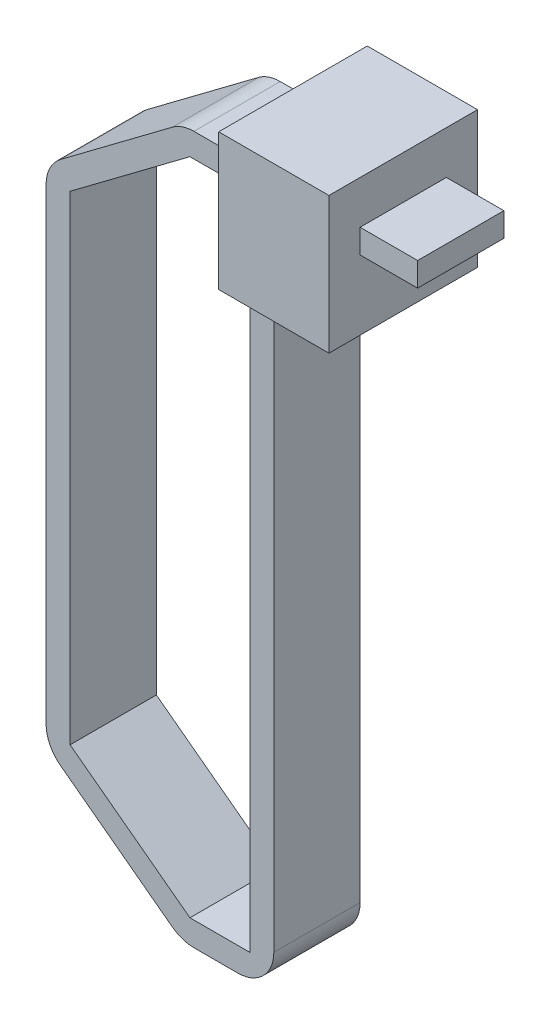
ISO-10303-21;
HEADER;
FILE_DESCRIPTION(('STEP AP214'),'2;1');
FILE_NAME('part.step','',(''),(''),'','','');
FILE_SCHEMA(('AUTOMOTIVE_DESIGN { 1 0 10303 214 1 1 1 1 }'));
ENDSEC;
DATA;
#1=APPLICATION_CONTEXT('core data for automotive mechanical design processes');
#2=APPLICATION_PROTOCOL_DEFINITION('international standard','automotive_design',2000,#1);
#3=PRODUCT_CONTEXT('',#1,'mechanical');
#4=PRODUCT('Part','Part','',(#3));
#5=PRODUCT_RELATED_PRODUCT_CATEGORY('part','',(#4));
#6=PRODUCT_DEFINITION_FORMATION('','',#4);
#7=PRODUCT_DEFINITION_CONTEXT('part definition',#1,'design');
#8=PRODUCT_DEFINITION('design','',#6,#7);
#9=PRODUCT_DEFINITION_SHAPE('','',#8);
#10=(LENGTH_UNIT() NAMED_UNIT(*) SI_UNIT(.MILLI.,.METRE.));
#11=(NAMED_UNIT(*) PLANE_ANGLE_UNIT() SI_UNIT($,.RADIAN.));
#12=(NAMED_UNIT(*) SI_UNIT($,.STERADIAN.) SOLID_ANGLE_UNIT());
#13=UNCERTAINTY_MEASURE_WITH_UNIT(LENGTH_MEASURE(1.E-05),#10,'distance_accuracy_value','');
#14=(GEOMETRIC_REPRESENTATION_CONTEXT(3) GLOBAL_UNCERTAINTY_ASSIGNED_CONTEXT((#13)) GLOBAL_UNIT_ASSIGNED_CONTEXT((#10,
#11,#12)) REPRESENTATION_CONTEXT('',''));
#15=CARTESIAN_POINT('',(0.,0.,0.));
#16=DIRECTION('',(0.,0.,1.));
#17=DIRECTION('',(1.,0.,0.));
#18=AXIS2_PLACEMENT_3D('',#15,#16,#17);
#19=CARTESIAN_POINT('',(12.065,18.7325,2.286));
#20=DIRECTION('',(-1.,0.,0.));
#21=DIRECTION('',(0.,0.,1.));
#22=AXIS2_PLACEMENT_3D('',#19,#20,#21);
#23=PLANE('',#22);
#24=DIRECTION('',(0.,0.,-1.));
#25=VECTOR('',#24,1.);
#26=CARTESIAN_POINT('',(12.065,18.7325,2.286));
#27=LINE('',#26,#25);
#28=CARTESIAN_POINT('',(12.065,18.7325,-2.286));
#29=VERTEX_POINT('',#28);
#30=CARTESIAN_POINT('',(12.065,18.7325,2.286));
#31=VERTEX_POINT('',#30);
#32=EDGE_CURVE('E308',#29,#31,#27,.F.);
#33=ORIENTED_EDGE('',*,*,#32,.T.);
#34=DIRECTION('',(0.,1.,0.));
#35=VECTOR('',#34,1.);
#36=CARTESIAN_POINT('',(12.065,0.,2.286));
#37=LINE('',#36,#35);
#38=CARTESIAN_POINT('',(12.065,17.4625,2.286));
#39=VERTEX_POINT('',#38);
#40=EDGE_CURVE('E311',#39,#31,#37,.T.);
#41=ORIENTED_EDGE('',*,*,#40,.F.);
#42=DIRECTION('',(0.,0.,1.));
#43=VECTOR('',#42,1.);
#44=CARTESIAN_POINT('',(12.065,17.4625,2.286));
#45=LINE('',#44,#43);
#46=CARTESIAN_POINT('',(12.065,17.4625,-2.286));
#47=VERTEX_POINT('',#46);
#48=EDGE_CURVE('E299',#39,#47,#45,.F.);
#49=ORIENTED_EDGE('',*,*,#48,.T.);
#50=DIRECTION('',(0.,1.,0.));
#51=VECTOR('',#50,1.);
#52=CARTESIAN_POINT('',(12.065,0.,-2.286));
#53=LINE('',#52,#51);
#54=EDGE_CURVE('E348',#47,#29,#53,.T.);
#55=ORIENTED_EDGE('',*,*,#54,.T.);
#56=EDGE_LOOP('',(#33,#41,#49,#55));
#57=FACE_BOUND('',#56,.T.);
#58=ADVANCED_FACE('F17',(#57),#23,.F.);
#59=CARTESIAN_POINT('',(0.,0.,-2.286));
#60=DIRECTION('',(0.,0.,1.));
#61=DIRECTION('',(1.,0.,0.));
#62=AXIS2_PLACEMENT_3D('',#59,#60,#61);
#63=PLANE('',#62);
#64=DIRECTION('',(0.,1.,0.));
#65=VECTOR('',#64,1.);
#66=CARTESIAN_POINT('',(9.017,0.,-2.286));
#67=LINE('',#66,#65);
#68=CARTESIAN_POINT('',(9.017,18.7325,-2.286));
#69=VERTEX_POINT('',#68);
#70=CARTESIAN_POINT('',(9.017,17.4625,-2.286));
#71=VERTEX_POINT('',#70);
#72=EDGE_CURVE('E345',#69,#71,#67,.F.);
#73=ORIENTED_EDGE('',*,*,#72,.F.);
#74=DIRECTION('',(1.,0.,0.));
#75=VECTOR('',#74,1.);
#76=CARTESIAN_POINT('',(4.445,18.7325,-2.286));
#77=LINE('',#76,#75);
#78=EDGE_CURVE('E302',#69,#29,#77,.T.);
#79=ORIENTED_EDGE('',*,*,#78,.T.);
#80=ORIENTED_EDGE('',*,*,#54,.F.);
#81=DIRECTION('',(1.,0.,0.));
#82=VECTOR('',#81,1.);
#83=CARTESIAN_POINT('',(4.445,17.4625,-2.286));
#84=LINE('',#83,#82);
#85=EDGE_CURVE('E296',#47,#71,#84,.F.);
#86=ORIENTED_EDGE('',*,*,#85,.T.);
#87=EDGE_LOOP('',(#73,#79,#80,#86));
#88=FACE_BOUND('',#87,.T.);
#89=ADVANCED_FACE('F756',(#88),#63,.F.);
#90=CARTESIAN_POINT('',(0.,0.,2.286));
#91=DIRECTION('',(0.,0.,1.));
#92=DIRECTION('',(1.,0.,0.));
#93=AXIS2_PLACEMENT_3D('',#90,#91,#92);
#94=PLANE('',#93);
#95=ORIENTED_EDGE('',*,*,#40,.T.);
#96=DIRECTION('',(1.,0.,0.));
#97=VECTOR('',#96,1.);
#98=CARTESIAN_POINT('',(4.445,18.7325,2.286));
#99=LINE('',#98,#97);
#100=CARTESIAN_POINT('',(9.017,18.7325,2.286));
#101=VERTEX_POINT('',#100);
#102=EDGE_CURVE('E305',#31,#101,#99,.F.);
#103=ORIENTED_EDGE('',*,*,#102,.T.);
#104=DIRECTION('',(0.,1.,0.));
#105=VECTOR('',#104,1.);
#106=CARTESIAN_POINT('',(9.017,0.,2.286));
#107=LINE('',#106,#105);
#108=CARTESIAN_POINT('',(9.017,17.4625,2.286));
#109=VERTEX_POINT('',#108);
#110=EDGE_CURVE('E342',#101,#109,#107,.F.);
#111=ORIENTED_EDGE('',*,*,#110,.T.);
#112=DIRECTION('',(1.,0.,0.));
#113=VECTOR('',#112,1.);
#114=CARTESIAN_POINT('',(4.445,17.4625,2.286));
#115=LINE('',#114,#113);
#116=EDGE_CURVE('E122',#109,#39,#115,.T.);
#117=ORIENTED_EDGE('',*,*,#116,.T.);
#118=EDGE_LOOP('',(#95,#103,#111,#117));
#119=FACE_BOUND('',#118,.T.);
#120=ADVANCED_FACE('F747',(#119),#94,.T.);
#121=CARTESIAN_POINT('',(4.445,18.7325,2.286));
#122=DIRECTION('',(0.,-1.,0.));
#123=DIRECTION('',(0.,0.,-1.));
#124=AXIS2_PLACEMENT_3D('',#121,#122,#123);
#125=PLANE('',#124);
#126=DIRECTION('',(0.,0.,1.));
#127=VECTOR('',#126,1.);
#128=CARTESIAN_POINT('',(9.017,18.7325,3.937));
#129=LINE('',#128,#127);
#130=EDGE_CURVE('E265',#69,#101,#129,.T.);
#131=ORIENTED_EDGE('',*,*,#130,.T.);
#132=ORIENTED_EDGE('',*,*,#102,.F.);
#133=ORIENTED_EDGE('',*,*,#32,.F.);
#134=ORIENTED_EDGE('',*,*,#78,.F.);
#135=EDGE_LOOP('',(#131,#132,#133,#134));
#136=FACE_BOUND('',#135,.T.);
#137=ADVANCED_FACE('F738',(#136),#125,.F.);
#138=CARTESIAN_POINT('',(4.445,17.4625,2.286));
#139=DIRECTION('',(0.,1.,0.));
#140=DIRECTION('',(0.,0.,1.));
#141=AXIS2_PLACEMENT_3D('',#138,#139,#140);
#142=PLANE('',#141);
#143=DIRECTION('',(0.,0.,1.));
#144=VECTOR('',#143,1.);
#145=CARTESIAN_POINT('',(9.017,17.4625,3.937));
#146=LINE('',#145,#144);
#147=EDGE_CURVE('E262',#109,#71,#146,.F.);
#148=ORIENTED_EDGE('',*,*,#147,.T.);
#149=ORIENTED_EDGE('',*,*,#85,.F.);
#150=ORIENTED_EDGE('',*,*,#48,.F.);
#151=ORIENTED_EDGE('',*,*,#116,.F.);
#152=EDGE_LOOP('',(#148,#149,#150,#151));
#153=FACE_BOUND('',#152,.T.);
#154=ADVANCED_FACE('F730',(#153),#142,.F.);
#155=CARTESIAN_POINT('',(0.211666666666673,-16.8275,2.286));
#156=DIRECTION('',(0.,0.,-1.));
#157=DIRECTION('',(-1.,0.,0.));
#158=AXIS2_PLACEMENT_3D('',#155,#156,#157);
#159=CYLINDRICAL_SURFACE('',#158,1.905);
#160=CARTESIAN_POINT('',(0.211666666666673,-16.8275,2.286));
#161=DIRECTION('',(0.,0.,-1.));
#162=DIRECTION('',(-1.,0.,0.));
#163=AXIS2_PLACEMENT_3D('',#160,#161,#162);
#164=CIRCLE('',#163,1.905);
#165=CARTESIAN_POINT('',(0.211666666666674,-18.7325,2.286));
#166=VERTEX_POINT('',#165);
#167=CARTESIAN_POINT('',(-0.931333333333327,-18.3515,2.286));
#168=VERTEX_POINT('',#167);
#169=EDGE_CURVE('E121',#166,#168,#164,.T.);
#170=ORIENTED_EDGE('',*,*,#169,.T.);
#171=DIRECTION('',(0.,0.,1.));
#172=VECTOR('',#171,1.);
#173=CARTESIAN_POINT('',(-0.931333333333327,-18.3515,2.286));
#174=LINE('',#173,#172);
#175=CARTESIAN_POINT('',(-0.931333333333327,-18.3515,-2.286));
#176=VERTEX_POINT('',#175);
#177=EDGE_CURVE('E119',#168,#176,#174,.F.);
#178=ORIENTED_EDGE('',*,*,#177,.T.);
#179=CARTESIAN_POINT('',(0.211666666666673,-16.8275,-2.286));
#180=DIRECTION('',(0.,0.,-1.));
#181=DIRECTION('',(-1.,0.,0.));
#182=AXIS2_PLACEMENT_3D('',#179,#180,#181);
#183=CIRCLE('',#182,1.905);
#184=CARTESIAN_POINT('',(0.211666666666674,-18.7325,-2.286));
#185=VERTEX_POINT('',#184);
#186=EDGE_CURVE('E20',#176,#185,#183,.F.);
#187=ORIENTED_EDGE('',*,*,#186,.T.);
#188=DIRECTION('',(0.,0.,1.));
#189=VECTOR('',#188,1.);
#190=CARTESIAN_POINT('',(0.211666666666674,-18.7325,2.286));
#191=LINE('',#190,#189);
#192=EDGE_CURVE('E116',#185,#166,#191,.T.);
#193=ORIENTED_EDGE('',*,*,#192,.T.);
#194=EDGE_LOOP('',(#170,#178,#187,#193));
#195=FACE_BOUND('',#194,.T.);
#196=ADVANCED_FACE('F115',(#195),#159,.T.);
#197=CARTESIAN_POINT('',(0.211666666666673,16.8275,2.286));
#198=DIRECTION('',(0.,0.,-1.));
#199=DIRECTION('',(-1.,0.,0.));
#200=AXIS2_PLACEMENT_3D('',#197,#198,#199);
#201=CYLINDRICAL_SURFACE('',#200,1.905);
#202=CARTESIAN_POINT('',(0.211666666666673,16.8275,2.286));
#203=DIRECTION('',(0.,0.,-1.));
#204=DIRECTION('',(-1.,0.,0.));
#205=AXIS2_PLACEMENT_3D('',#202,#203,#204);
#206=CIRCLE('',#205,1.905);
#207=CARTESIAN_POINT('',(-0.931333333333326,18.3515,2.286));
#208=VERTEX_POINT('',#207);
#209=CARTESIAN_POINT('',(0.211666666666673,18.7325,2.286));
#210=VERTEX_POINT('',#209);
#211=EDGE_CURVE('E329',#208,#210,#206,.T.);
#212=ORIENTED_EDGE('',*,*,#211,.T.);
#213=DIRECTION('',(0.,0.,1.));
#214=VECTOR('',#213,1.);
#215=CARTESIAN_POINT('',(0.211666666666673,18.7325,2.286));
#216=LINE('',#215,#214);
#217=CARTESIAN_POINT('',(0.211666666666673,18.7325,-2.286));
#218=VERTEX_POINT('',#217);
#219=EDGE_CURVE('E211',#210,#218,#216,.F.);
#220=ORIENTED_EDGE('',*,*,#219,.T.);
#221=CARTESIAN_POINT('',(0.211666666666673,16.8275,-2.286));
#222=DIRECTION('',(0.,0.,-1.));
#223=DIRECTION('',(-1.,0.,0.));
#224=AXIS2_PLACEMENT_3D('',#221,#222,#223);
#225=CIRCLE('',#224,1.905);
#226=CARTESIAN_POINT('',(-0.931333333333326,18.3515,-2.286));
#227=VERTEX_POINT('',#226);
#228=EDGE_CURVE('E365',#218,#227,#225,.F.);
#229=ORIENTED_EDGE('',*,*,#228,.T.);
#230=DIRECTION('',(0.,0.,1.));
#231=VECTOR('',#230,1.);
#232=CARTESIAN_POINT('',(-0.931333333333325,18.3515,2.286));
#233=LINE('',#232,#231);
#234=EDGE_CURVE('E227',#227,#208,#233,.T.);
#235=ORIENTED_EDGE('',*,*,#234,.T.);
#236=EDGE_LOOP('',(#212,#220,#229,#235));
#237=FACE_BOUND('',#236,.T.);
#238=ADVANCED_FACE('F517',(#237),#201,.T.);
#239=CARTESIAN_POINT('',(3.175,13.7795,3.937));
#240=DIRECTION('',(0.,1.,0.));
#241=DIRECTION('',(0.,0.,1.));
#242=AXIS2_PLACEMENT_3D('',#239,#240,#241);
#243=PLANE('',#242);
#244=DIRECTION('',(-1.,0.,0.));
#245=VECTOR('',#244,1.);
#246=CARTESIAN_POINT('',(2.54,13.7795,2.286));
#247=LINE('',#246,#245);
#248=CARTESIAN_POINT('',(3.175,13.7795,2.286));
#249=VERTEX_POINT('',#248);
#250=CARTESIAN_POINT('',(4.445,13.7795,2.286));
#251=VERTEX_POINT('',#250);
#252=EDGE_CURVE('E199',#249,#251,#247,.F.);
#253=ORIENTED_EDGE('',*,*,#252,.T.);
#254=DIRECTION('',(0.,0.,1.));
#255=VECTOR('',#254,1.);
#256=CARTESIAN_POINT('',(4.445,13.7795,2.286));
#257=LINE('',#256,#255);
#258=CARTESIAN_POINT('',(4.445,13.7795,-2.286));
#259=VERTEX_POINT('',#258);
#260=EDGE_CURVE('E242',#251,#259,#257,.F.);
#261=ORIENTED_EDGE('',*,*,#260,.T.);
#262=DIRECTION('',(1.,0.,0.));
#263=VECTOR('',#262,1.);
#264=CARTESIAN_POINT('',(3.175,13.7795,-2.286));
#265=LINE('',#264,#263);
#266=CARTESIAN_POINT('',(3.175,13.7795,-2.286));
#267=VERTEX_POINT('',#266);
#268=EDGE_CURVE('E280',#267,#259,#265,.T.);
#269=ORIENTED_EDGE('',*,*,#268,.F.);
#270=DIRECTION('',(0.,0.,1.));
#271=VECTOR('',#270,1.);
#272=CARTESIAN_POINT('',(3.175,13.7795,3.937));
#273=LINE('',#272,#271);
#274=CARTESIAN_POINT('',(3.175,13.7795,-3.937));
#275=VERTEX_POINT('',#274);
#276=EDGE_CURVE('E291',#275,#267,#273,.T.);
#277=ORIENTED_EDGE('',*,*,#276,.F.);
#278=DIRECTION('',(1.,0.,0.));
#279=VECTOR('',#278,1.);
#280=CARTESIAN_POINT('',(0.,13.7795,-3.937));
#281=LINE('',#280,#279);
#282=CARTESIAN_POINT('',(9.017,13.7795,-3.937));
#283=VERTEX_POINT('',#282);
#284=EDGE_CURVE('E169',#275,#283,#281,.T.);
#285=ORIENTED_EDGE('',*,*,#284,.T.);
#286=DIRECTION('',(0.,0.,1.));
#287=VECTOR('',#286,1.);
#288=CARTESIAN_POINT('',(9.017,13.7795,3.937));
#289=LINE('',#288,#287);
#290=CARTESIAN_POINT('',(9.017,13.7795,3.937));
#291=VERTEX_POINT('',#290);
#292=EDGE_CURVE('E245',#283,#291,#289,.T.);
#293=ORIENTED_EDGE('',*,*,#292,.T.);
#294=DIRECTION('',(1.,0.,0.));
#295=VECTOR('',#294,1.);
#296=CARTESIAN_POINT('',(0.,13.7795,3.937));
#297=LINE('',#296,#295);
#298=CARTESIAN_POINT('',(3.175,13.7795,3.937));
#299=VERTEX_POINT('',#298);
#300=EDGE_CURVE('E179',#299,#291,#297,.T.);
#301=ORIENTED_EDGE('',*,*,#300,.F.);
#302=DIRECTION('',(0.,0.,1.));
#303=VECTOR('',#302,1.);
#304=CARTESIAN_POINT('',(3.175,13.7795,3.937));
#305=LINE('',#304,#303);
#306=EDGE_CURVE('E268',#249,#299,#305,.T.);
#307=ORIENTED_EDGE('',*,*,#306,.F.);
#308=EDGE_LOOP('',(#253,#261,#269,#277,#285,#293,#301,#307));
#309=FACE_BOUND('',#308,.T.);
#310=ADVANCED_FACE('F479',(#309),#243,.F.);
#311=CARTESIAN_POINT('',(9.017,21.0185,3.937));
#312=DIRECTION('',(-1.,0.,0.));
#313=DIRECTION('',(0.,0.,1.));
#314=AXIS2_PLACEMENT_3D('',#311,#312,#313);
#315=PLANE('',#314);
#316=DIRECTION('',(0.,0.,-1.));
#317=VECTOR('',#316,1.);
#318=CARTESIAN_POINT('',(9.017,21.0185,3.937));
#319=LINE('',#318,#317);
#320=CARTESIAN_POINT('',(9.017,21.0185,-3.937));
#321=VERTEX_POINT('',#320);
#322=CARTESIAN_POINT('',(9.017,21.0185,3.937));
#323=VERTEX_POINT('',#322);
#324=EDGE_CURVE('E173',#321,#323,#319,.F.);
#325=ORIENTED_EDGE('',*,*,#324,.T.);
#326=DIRECTION('',(0.,1.,0.));
#327=VECTOR('',#326,1.);
#328=CARTESIAN_POINT('',(9.017,0.,3.937));
#329=LINE('',#328,#327);
#330=EDGE_CURVE('E176',#291,#323,#329,.T.);
#331=ORIENTED_EDGE('',*,*,#330,.F.);
#332=ORIENTED_EDGE('',*,*,#292,.F.);
#333=DIRECTION('',(0.,1.,0.));
#334=VECTOR('',#333,1.);
#335=CARTESIAN_POINT('',(9.017,0.,-3.937));
#336=LINE('',#335,#334);
#337=EDGE_CURVE('E166',#283,#321,#336,.T.);
#338=ORIENTED_EDGE('',*,*,#337,.T.);
#339=EDGE_LOOP('',(#325,#331,#332,#338));
#340=FACE_BOUND('',#339,.T.);
#341=ORIENTED_EDGE('',*,*,#110,.F.);
#342=ORIENTED_EDGE('',*,*,#130,.F.);
#343=ORIENTED_EDGE('',*,*,#72,.T.);
#344=ORIENTED_EDGE('',*,*,#147,.F.);
#345=EDGE_LOOP('',(#341,#342,#343,#344));
#346=FACE_BOUND('',#345,.T.);
#347=ADVANCED_FACE('F700',(#340,#346),#315,.F.);
#348=CARTESIAN_POINT('',(-6.35,-12.7,2.286));
#349=DIRECTION('',(1.,0.,0.));
#350=DIRECTION('',(0.,0.,-1.));
#351=AXIS2_PLACEMENT_3D('',#348,#349,#350);
#352=PLANE('',#351);
#353=DIRECTION('',(0.,1.,0.));
#354=VECTOR('',#353,1.);
#355=CARTESIAN_POINT('',(-6.35,-16.8275,2.286));
#356=LINE('',#355,#354);
#357=CARTESIAN_POINT('',(-6.35,12.7,2.286));
#358=VERTEX_POINT('',#357);
#359=CARTESIAN_POINT('',(-6.35,-12.7,2.286));
#360=VERTEX_POINT('',#359);
#361=EDGE_CURVE('E205',#358,#360,#356,.F.);
#362=ORIENTED_EDGE('',*,*,#361,.T.);
#363=DIRECTION('',(0.,0.,1.));
#364=VECTOR('',#363,1.);
#365=CARTESIAN_POINT('',(-6.35,-12.7,2.286));
#366=LINE('',#365,#364);
#367=CARTESIAN_POINT('',(-6.35,-12.7,-2.286));
#368=VERTEX_POINT('',#367);
#369=EDGE_CURVE('E220',#368,#360,#366,.T.);
#370=ORIENTED_EDGE('',*,*,#369,.F.);
#371=DIRECTION('',(0.,1.,0.));
#372=VECTOR('',#371,1.);
#373=CARTESIAN_POINT('',(-6.35,-16.8275,-2.286));
#374=LINE('',#373,#372);
#375=CARTESIAN_POINT('',(-6.35,12.7,-2.286));
#376=VERTEX_POINT('',#375);
#377=EDGE_CURVE('E152',#376,#368,#374,.F.);
#378=ORIENTED_EDGE('',*,*,#377,.F.);
#379=DIRECTION('',(0.,0.,1.));
#380=VECTOR('',#379,1.);
#381=CARTESIAN_POINT('',(-6.35,12.7,2.286));
#382=LINE('',#381,#380);
#383=EDGE_CURVE('E217',#358,#376,#382,.F.);
#384=ORIENTED_EDGE('',*,*,#383,.F.);
#385=EDGE_LOOP('',(#362,#370,#378,#384));
#386=FACE_BOUND('',#385,.T.);
#387=ADVANCED_FACE('F497',(#386),#352,.T.);
#388=CARTESIAN_POINT('',(4.445,16.8275,2.286));
#389=DIRECTION('',(-1.,0.,0.));
#390=DIRECTION('',(0.,0.,1.));
#391=AXIS2_PLACEMENT_3D('',#388,#389,#390);
#392=PLANE('',#391);
#393=DIRECTION('',(0.,1.,0.));
#394=VECTOR('',#393,1.);
#395=CARTESIAN_POINT('',(4.445,-16.8275,2.286));
#396=LINE('',#395,#394);
#397=CARTESIAN_POINT('',(4.445,-16.8275,2.286));
#398=VERTEX_POINT('',#397);
#399=EDGE_CURVE('E197',#251,#398,#396,.F.);
#400=ORIENTED_EDGE('',*,*,#399,.T.);
#401=DIRECTION('',(0.,0.,-1.));
#402=VECTOR('',#401,1.);
#403=CARTESIAN_POINT('',(4.445,-16.8275,2.286));
#404=LINE('',#403,#402);
#405=CARTESIAN_POINT('',(4.445,-16.8275,-2.286));
#406=VERTEX_POINT('',#405);
#407=EDGE_CURVE('E132',#406,#398,#404,.F.);
#408=ORIENTED_EDGE('',*,*,#407,.F.);
#409=DIRECTION('',(0.,1.,0.));
#410=VECTOR('',#409,1.);
#411=CARTESIAN_POINT('',(4.445,-16.8275,-2.286));
#412=LINE('',#411,#410);
#413=EDGE_CURVE('E142',#259,#406,#412,.F.);
#414=ORIENTED_EDGE('',*,*,#413,.F.);
#415=ORIENTED_EDGE('',*,*,#260,.F.);
#416=EDGE_LOOP('',(#400,#408,#414,#415));
#417=FACE_BOUND('',#416,.T.);
#418=ADVANCED_FACE('F485',(#417),#392,.F.);
#419=CARTESIAN_POINT('',(2.54,-16.8275,2.286));
#420=DIRECTION('',(0.,0.,-1.));
#421=DIRECTION('',(-1.,0.,0.));
#422=AXIS2_PLACEMENT_3D('',#419,#420,#421);
#423=CYLINDRICAL_SURFACE('',#422,1.905);
#424=CARTESIAN_POINT('',(2.54,-16.8275,2.286));
#425=DIRECTION('',(0.,0.,-1.));
#426=DIRECTION('',(-1.,0.,0.));
#427=AXIS2_PLACEMENT_3D('',#424,#425,#426);
#428=CIRCLE('',#427,1.905);
#429=CARTESIAN_POINT('',(2.54,-18.7325,2.286));
#430=VERTEX_POINT('',#429);
#431=EDGE_CURVE('E196',#398,#430,#428,.T.);
#432=ORIENTED_EDGE('',*,*,#431,.T.);
#433=DIRECTION('',(0.,0.,1.));
#434=VECTOR('',#433,1.);
#435=CARTESIAN_POINT('',(2.54,-18.7325,2.286));
#436=LINE('',#435,#434);
#437=CARTESIAN_POINT('',(2.54,-18.7325,-2.286));
#438=VERTEX_POINT('',#437);
#439=EDGE_CURVE('E131',#430,#438,#436,.F.);
#440=ORIENTED_EDGE('',*,*,#439,.T.);
#441=CARTESIAN_POINT('',(2.54,-16.8275,-2.286));
#442=DIRECTION('',(0.,0.,-1.));
#443=DIRECTION('',(-1.,0.,0.));
#444=AXIS2_PLACEMENT_3D('',#441,#442,#443);
#445=CIRCLE('',#444,1.905);
#446=EDGE_CURVE('E137',#406,#438,#445,.T.);
#447=ORIENTED_EDGE('',*,*,#446,.F.);
#448=ORIENTED_EDGE('',*,*,#407,.T.);
#449=EDGE_LOOP('',(#432,#440,#447,#448));
#450=FACE_BOUND('',#449,.T.);
#451=ADVANCED_FACE('F488',(#450),#423,.T.);
#452=CARTESIAN_POINT('',(2.54,-18.7325,2.286));
#453=DIRECTION('',(0.,1.,0.));
#454=DIRECTION('',(-1.,0.,0.));
#455=AXIS2_PLACEMENT_3D('',#452,#453,#454);
#456=PLANE('',#455);
#457=ORIENTED_EDGE('',*,*,#439,.F.);
#458=DIRECTION('',(-1.,0.,0.));
#459=VECTOR('',#458,1.);
#460=CARTESIAN_POINT('',(2.54,-18.7325,2.286));
#461=LINE('',#460,#459);
#462=EDGE_CURVE('E130',#430,#166,#461,.T.);
#463=ORIENTED_EDGE('',*,*,#462,.T.);
#464=ORIENTED_EDGE('',*,*,#192,.F.);
#465=DIRECTION('',(-1.,0.,0.));
#466=VECTOR('',#465,1.);
#467=CARTESIAN_POINT('',(2.54,-18.7325,-2.286));
#468=LINE('',#467,#466);
#469=EDGE_CURVE('E127',#438,#185,#468,.T.);
#470=ORIENTED_EDGE('',*,*,#469,.F.);
#471=EDGE_LOOP('',(#457,#463,#464,#470));
#472=FACE_BOUND('',#471,.T.);
#473=ADVANCED_FACE('F126',(#472),#456,.F.);
#474=CARTESIAN_POINT('',(-0.931333333333327,-18.3515,2.286));
#475=DIRECTION('',(0.6,0.8,0.));
#476=DIRECTION('',(-0.8,0.6,0.));
#477=AXIS2_PLACEMENT_3D('',#474,#475,#476);
#478=PLANE('',#477);
#479=ORIENTED_EDGE('',*,*,#177,.F.);
#480=DIRECTION('',(-0.8,0.6,0.));
#481=VECTOR('',#480,1.);
#482=CARTESIAN_POINT('',(-0.931333333333327,-18.3515,2.286));
#483=LINE('',#482,#481);
#484=CARTESIAN_POINT('',(-6.858,-13.9065,2.286));
#485=VERTEX_POINT('',#484);
#486=EDGE_CURVE('E193',#168,#485,#483,.T.);
#487=ORIENTED_EDGE('',*,*,#486,.T.);
#488=DIRECTION('',(0.,0.,-1.));
#489=VECTOR('',#488,1.);
#490=CARTESIAN_POINT('',(-6.858,-13.9065,2.286));
#491=LINE('',#490,#489);
#492=CARTESIAN_POINT('',(-6.858,-13.9065,-2.286));
#493=VERTEX_POINT('',#492);
#494=EDGE_CURVE('E235',#493,#485,#491,.F.);
#495=ORIENTED_EDGE('',*,*,#494,.F.);
#496=DIRECTION('',(-0.8,0.6,0.));
#497=VECTOR('',#496,1.);
#498=CARTESIAN_POINT('',(-0.931333333333327,-18.3515,-2.286));
#499=LINE('',#498,#497);
#500=EDGE_CURVE('E138',#176,#493,#499,.T.);
#501=ORIENTED_EDGE('',*,*,#500,.F.);
#502=EDGE_LOOP('',(#479,#487,#495,#501));
#503=FACE_BOUND('',#502,.T.);
#504=ADVANCED_FACE('F368',(#503),#478,.F.);
#505=CARTESIAN_POINT('',(-5.715,-12.3825,2.286));
#506=DIRECTION('',(0.,0.,-1.));
#507=DIRECTION('',(-1.,0.,0.));
#508=AXIS2_PLACEMENT_3D('',#505,#506,#507);
#509=CYLINDRICAL_SURFACE('',#508,1.905);
#510=CARTESIAN_POINT('',(-5.715,-12.3825,2.286));
#511=DIRECTION('',(0.,0.,-1.));
#512=DIRECTION('',(-1.,0.,0.));
#513=AXIS2_PLACEMENT_3D('',#510,#511,#512);
#514=CIRCLE('',#513,1.905);
#515=CARTESIAN_POINT('',(-7.62,-12.3825,2.286));
#516=VERTEX_POINT('',#515);
#517=EDGE_CURVE('E192',#485,#516,#514,.T.);
#518=ORIENTED_EDGE('',*,*,#517,.T.);
#519=DIRECTION('',(0.,0.,-1.));
#520=VECTOR('',#519,1.);
#521=CARTESIAN_POINT('',(-7.62,-12.3825,2.286));
#522=LINE('',#521,#520);
#523=CARTESIAN_POINT('',(-7.62,-12.3825,-2.286));
#524=VERTEX_POINT('',#523);
#525=EDGE_CURVE('E233',#516,#524,#522,.T.);
#526=ORIENTED_EDGE('',*,*,#525,.T.);
#527=CARTESIAN_POINT('',(-5.715,-12.3825,-2.286));
#528=DIRECTION('',(0.,0.,-1.));
#529=DIRECTION('',(-1.,0.,0.));
#530=AXIS2_PLACEMENT_3D('',#527,#528,#529);
#531=CIRCLE('',#530,1.905);
#532=EDGE_CURVE('E140',#493,#524,#531,.T.);
#533=ORIENTED_EDGE('',*,*,#532,.F.);
#534=ORIENTED_EDGE('',*,*,#494,.T.);
#535=EDGE_LOOP('',(#518,#526,#533,#534));
#536=FACE_BOUND('',#535,.T.);
#537=ADVANCED_FACE('F375',(#536),#509,.T.);
#538=CARTESIAN_POINT('',(-7.62,-12.3825,2.286));
#539=DIRECTION('',(1.,0.,0.));
#540=DIRECTION('',(0.,0.,-1.));
#541=AXIS2_PLACEMENT_3D('',#538,#539,#540);
#542=PLANE('',#541);
#543=ORIENTED_EDGE('',*,*,#525,.F.);
#544=DIRECTION('',(0.,1.,0.));
#545=VECTOR('',#544,1.);
#546=CARTESIAN_POINT('',(-7.62,-16.8275,2.286));
#547=LINE('',#546,#545);
#548=CARTESIAN_POINT('',(-7.62,12.3825,2.286));
#549=VERTEX_POINT('',#548);
#550=EDGE_CURVE('E190',#516,#549,#547,.T.);
#551=ORIENTED_EDGE('',*,*,#550,.T.);
#552=DIRECTION('',(0.,0.,-1.));
#553=VECTOR('',#552,1.);
#554=CARTESIAN_POINT('',(-7.62,12.3825,2.286));
#555=LINE('',#554,#553);
#556=CARTESIAN_POINT('',(-7.62,12.3825,-2.286));
#557=VERTEX_POINT('',#556);
#558=EDGE_CURVE('E230',#557,#549,#555,.F.);
#559=ORIENTED_EDGE('',*,*,#558,.F.);
#560=DIRECTION('',(0.,1.,0.));
#561=VECTOR('',#560,1.);
#562=CARTESIAN_POINT('',(-7.62,-16.8275,-2.286));
#563=LINE('',#562,#561);
#564=EDGE_CURVE('E358',#524,#557,#563,.T.);
#565=ORIENTED_EDGE('',*,*,#564,.F.);
#566=EDGE_LOOP('',(#543,#551,#559,#565));
#567=FACE_BOUND('',#566,.T.);
#568=ADVANCED_FACE('F379',(#567),#542,.F.);
#569=CARTESIAN_POINT('',(-5.715,12.3825,2.286));
#570=DIRECTION('',(0.,0.,-1.));
#571=DIRECTION('',(-1.,0.,0.));
#572=AXIS2_PLACEMENT_3D('',#569,#570,#571);
#573=CYLINDRICAL_SURFACE('',#572,1.905);
#574=CARTESIAN_POINT('',(-5.715,12.3825,2.286));
#575=DIRECTION('',(0.,0.,-1.));
#576=DIRECTION('',(-1.,0.,0.));
#577=AXIS2_PLACEMENT_3D('',#574,#575,#576);
#578=CIRCLE('',#577,1.905);
#579=CARTESIAN_POINT('',(-6.858,13.9065,2.286));
#580=VERTEX_POINT('',#579);
#581=EDGE_CURVE('E189',#549,#580,#578,.T.);
#582=ORIENTED_EDGE('',*,*,#581,.T.);
#583=DIRECTION('',(0.,0.,1.));
#584=VECTOR('',#583,1.);
#585=CARTESIAN_POINT('',(-6.858,13.9065,2.286));
#586=LINE('',#585,#584);
#587=CARTESIAN_POINT('',(-6.858,13.9065,-2.286));
#588=VERTEX_POINT('',#587);
#589=EDGE_CURVE('E223',#580,#588,#586,.F.);
#590=ORIENTED_EDGE('',*,*,#589,.T.);
#591=CARTESIAN_POINT('',(-5.715,12.3825,-2.286));
#592=DIRECTION('',(0.,0.,-1.));
#593=DIRECTION('',(-1.,0.,0.));
#594=AXIS2_PLACEMENT_3D('',#591,#592,#593);
#595=CIRCLE('',#594,1.905);
#596=EDGE_CURVE('E354',#557,#588,#595,.T.);
#597=ORIENTED_EDGE('',*,*,#596,.F.);
#598=ORIENTED_EDGE('',*,*,#558,.T.);
#599=EDGE_LOOP('',(#582,#590,#597,#598));
#600=FACE_BOUND('',#599,.T.);
#601=ADVANCED_FACE('F525',(#600),#573,.T.);
#602=CARTESIAN_POINT('',(-6.858,13.9065,2.286));
#603=DIRECTION('',(0.6,-0.8,0.));
#604=DIRECTION('',(0.8,0.6,0.));
#605=AXIS2_PLACEMENT_3D('',#602,#603,#604);
#606=PLANE('',#605);
#607=ORIENTED_EDGE('',*,*,#589,.F.);
#608=DIRECTION('',(0.8,0.6,0.));
#609=VECTOR('',#608,1.);
#610=CARTESIAN_POINT('',(-6.858,13.9065,2.286));
#611=LINE('',#610,#609);
#612=EDGE_CURVE('E186',#580,#208,#611,.T.);
#613=ORIENTED_EDGE('',*,*,#612,.T.);
#614=ORIENTED_EDGE('',*,*,#234,.F.);
#615=DIRECTION('',(0.8,0.6,0.));
#616=VECTOR('',#615,1.);
#617=CARTESIAN_POINT('',(-6.858,13.9065,-2.286));
#618=LINE('',#617,#616);
#619=EDGE_CURVE('E357',#588,#227,#618,.T.);
#620=ORIENTED_EDGE('',*,*,#619,.F.);
#621=EDGE_LOOP('',(#607,#613,#614,#620));
#622=FACE_BOUND('',#621,.T.);
#623=ADVANCED_FACE('F522',(#622),#606,.F.);
#624=CARTESIAN_POINT('',(0.,-17.4625,2.286));
#625=DIRECTION('',(0.6,0.8,0.));
#626=DIRECTION('',(-0.8,0.6,0.));
#627=AXIS2_PLACEMENT_3D('',#624,#625,#626);
#628=PLANE('',#627);
#629=DIRECTION('',(0.8,-0.6,0.));
#630=VECTOR('',#629,1.);
#631=CARTESIAN_POINT('',(-6.35,-12.7,2.286));
#632=LINE('',#631,#630);
#633=CARTESIAN_POINT('',(0.,-17.4625,2.286));
#634=VERTEX_POINT('',#633);
#635=EDGE_CURVE('E202',#360,#634,#632,.T.);
#636=ORIENTED_EDGE('',*,*,#635,.T.);
#637=DIRECTION('',(0.,0.,1.));
#638=VECTOR('',#637,1.);
#639=CARTESIAN_POINT('',(0.,-17.4625,2.286));
#640=LINE('',#639,#638);
#641=CARTESIAN_POINT('',(0.,-17.4625,-2.286));
#642=VERTEX_POINT('',#641);
#643=EDGE_CURVE('E390',#642,#634,#640,.T.);
#644=ORIENTED_EDGE('',*,*,#643,.F.);
#645=DIRECTION('',(0.8,-0.6,0.));
#646=VECTOR('',#645,1.);
#647=CARTESIAN_POINT('',(-6.35,-12.7,-2.286));
#648=LINE('',#647,#646);
#649=EDGE_CURVE('E147',#368,#642,#648,.T.);
#650=ORIENTED_EDGE('',*,*,#649,.F.);
#651=ORIENTED_EDGE('',*,*,#369,.T.);
#652=EDGE_LOOP('',(#636,#644,#650,#651));
#653=FACE_BOUND('',#652,.T.);
#654=ADVANCED_FACE('F494',(#653),#628,.T.);
#655=CARTESIAN_POINT('',(-6.35,12.7,2.286));
#656=DIRECTION('',(0.6,-0.8,0.));
#657=DIRECTION('',(0.8,0.6,0.));
#658=AXIS2_PLACEMENT_3D('',#655,#656,#657);
#659=PLANE('',#658);
#660=DIRECTION('',(-0.8,-0.6,0.));
#661=VECTOR('',#660,1.);
#662=CARTESIAN_POINT('',(0.,17.4625,2.286));
#663=LINE('',#662,#661);
#664=CARTESIAN_POINT('',(0.,17.4625,2.286));
#665=VERTEX_POINT('',#664);
#666=EDGE_CURVE('E208',#665,#358,#663,.T.);
#667=ORIENTED_EDGE('',*,*,#666,.T.);
#668=ORIENTED_EDGE('',*,*,#383,.T.);
#669=DIRECTION('',(-0.8,-0.6,0.));
#670=VECTOR('',#669,1.);
#671=CARTESIAN_POINT('',(0.,17.4625,-2.286));
#672=LINE('',#671,#670);
#673=CARTESIAN_POINT('',(0.,17.4625,-2.286));
#674=VERTEX_POINT('',#673);
#675=EDGE_CURVE('E155',#674,#376,#672,.T.);
#676=ORIENTED_EDGE('',*,*,#675,.F.);
#677=DIRECTION('',(0.,0.,-1.));
#678=VECTOR('',#677,1.);
#679=CARTESIAN_POINT('',(0.,17.4625,2.286));
#680=LINE('',#679,#678);
#681=EDGE_CURVE('E271',#665,#674,#680,.T.);
#682=ORIENTED_EDGE('',*,*,#681,.F.);
#683=EDGE_LOOP('',(#667,#668,#676,#682));
#684=FACE_BOUND('',#683,.T.);
#685=ADVANCED_FACE('F501',(#684),#659,.T.);
#686=CARTESIAN_POINT('',(0.211666666666673,18.7325,2.286));
#687=DIRECTION('',(0.,-1.,0.));
#688=DIRECTION('',(1.,0.,0.));
#689=AXIS2_PLACEMENT_3D('',#686,#687,#688);
#690=PLANE('',#689);
#691=ORIENTED_EDGE('',*,*,#219,.F.);
#692=DIRECTION('',(-1.,0.,0.));
#693=VECTOR('',#692,1.);
#694=CARTESIAN_POINT('',(2.54,18.7325,2.286));
#695=LINE('',#694,#693);
#696=CARTESIAN_POINT('',(2.54,18.7325,2.286));
#697=VERTEX_POINT('',#696);
#698=EDGE_CURVE('E181',#210,#697,#695,.F.);
#699=ORIENTED_EDGE('',*,*,#698,.T.);
#700=DIRECTION('',(0.,0.,-1.));
#701=VECTOR('',#700,1.);
#702=CARTESIAN_POINT('',(2.54,18.7325,2.286));
#703=LINE('',#702,#701);
#704=CARTESIAN_POINT('',(2.54,18.7325,-2.286));
#705=VERTEX_POINT('',#704);
#706=EDGE_CURVE('E212',#705,#697,#703,.F.);
#707=ORIENTED_EDGE('',*,*,#706,.F.);
#708=DIRECTION('',(-1.,0.,0.));
#709=VECTOR('',#708,1.);
#710=CARTESIAN_POINT('',(2.54,18.7325,-2.286));
#711=LINE('',#710,#709);
#712=EDGE_CURVE('E385',#218,#705,#711,.F.);
#713=ORIENTED_EDGE('',*,*,#712,.F.);
#714=EDGE_LOOP('',(#691,#699,#707,#713));
#715=FACE_BOUND('',#714,.T.);
#716=ADVANCED_FACE('F514',(#715),#690,.F.);
#717=CARTESIAN_POINT('',(2.54,-16.8275,2.286));
#718=DIRECTION('',(0.,0.,-1.));
#719=DIRECTION('',(-1.,0.,0.));
#720=AXIS2_PLACEMENT_3D('',#717,#718,#719);
#721=PLANE('',#720);
#722=CARTESIAN_POINT('',(2.54,16.8275,2.286));
#723=DIRECTION('',(0.,0.,-1.));
#724=DIRECTION('',(-1.,0.,0.));
#725=AXIS2_PLACEMENT_3D('',#722,#723,#724);
#726=CIRCLE('',#725,1.905);
#727=CARTESIAN_POINT('',(3.175,18.6235512242138,2.286));
#728=VERTEX_POINT('',#727);
#729=EDGE_CURVE('E214',#697,#728,#726,.T.);
#730=ORIENTED_EDGE('',*,*,#729,.F.);
#731=ORIENTED_EDGE('',*,*,#698,.F.);
#732=ORIENTED_EDGE('',*,*,#211,.F.);
#733=ORIENTED_EDGE('',*,*,#612,.F.);
#734=ORIENTED_EDGE('',*,*,#581,.F.);
#735=ORIENTED_EDGE('',*,*,#550,.F.);
#736=ORIENTED_EDGE('',*,*,#517,.F.);
#737=ORIENTED_EDGE('',*,*,#486,.F.);
#738=ORIENTED_EDGE('',*,*,#169,.F.);
#739=ORIENTED_EDGE('',*,*,#462,.F.);
#740=ORIENTED_EDGE('',*,*,#431,.F.);
#741=ORIENTED_EDGE('',*,*,#399,.F.);
#742=ORIENTED_EDGE('',*,*,#252,.F.);
#743=DIRECTION('',(0.,1.,0.));
#744=VECTOR('',#743,1.);
#745=CARTESIAN_POINT('',(3.175,17.4625,2.286));
#746=LINE('',#745,#744);
#747=CARTESIAN_POINT('',(3.175,-17.4625,2.286));
#748=VERTEX_POINT('',#747);
#749=EDGE_CURVE('E283',#748,#249,#746,.T.);
#750=ORIENTED_EDGE('',*,*,#749,.F.);
#751=DIRECTION('',(1.,0.,0.));
#752=VECTOR('',#751,1.);
#753=CARTESIAN_POINT('',(3.175,-17.4625,2.286));
#754=LINE('',#753,#752);
#755=EDGE_CURVE('E252',#634,#748,#754,.T.);
#756=ORIENTED_EDGE('',*,*,#755,.F.);
#757=ORIENTED_EDGE('',*,*,#635,.F.);
#758=ORIENTED_EDGE('',*,*,#361,.F.);
#759=ORIENTED_EDGE('',*,*,#666,.F.);
#760=DIRECTION('',(1.,0.,0.));
#761=VECTOR('',#760,1.);
#762=CARTESIAN_POINT('',(0.,17.4625,2.286));
#763=LINE('',#762,#761);
#764=CARTESIAN_POINT('',(3.175,17.4625,2.286));
#765=VERTEX_POINT('',#764);
#766=EDGE_CURVE('E251',#765,#665,#763,.F.);
#767=ORIENTED_EDGE('',*,*,#766,.F.);
#768=DIRECTION('',(0.,1.,0.));
#769=VECTOR('',#768,1.);
#770=CARTESIAN_POINT('',(3.175,-16.8275,2.286));
#771=LINE('',#770,#769);
#772=EDGE_CURVE('E35',#728,#765,#771,.F.);
#773=ORIENTED_EDGE('',*,*,#772,.F.);
#774=EDGE_LOOP('',(#730,#731,#732,#733,#734,#735,#736,#737,#738,#739,#740,#741,#742,#750,#756,
#757,#758,#759,#767,#773));
#775=FACE_BOUND('',#774,.T.);
#776=ADVANCED_FACE('F370',(#775),#721,.F.);
#777=CARTESIAN_POINT('',(0.,0.,3.937));
#778=DIRECTION('',(0.,0.,1.));
#779=DIRECTION('',(1.,0.,0.));
#780=AXIS2_PLACEMENT_3D('',#777,#778,#779);
#781=PLANE('',#780);
#782=ORIENTED_EDGE('',*,*,#330,.T.);
#783=DIRECTION('',(1.,0.,0.));
#784=VECTOR('',#783,1.);
#785=CARTESIAN_POINT('',(3.175,21.0185,3.937));
#786=LINE('',#785,#784);
#787=CARTESIAN_POINT('',(3.175,21.0185,3.937));
#788=VERTEX_POINT('',#787);
#789=EDGE_CURVE('E170',#323,#788,#786,.F.);
#790=ORIENTED_EDGE('',*,*,#789,.T.);
#791=DIRECTION('',(0.,1.,0.));
#792=VECTOR('',#791,1.);
#793=CARTESIAN_POINT('',(3.175,17.4625,3.937));
#794=LINE('',#793,#792);
#795=EDGE_CURVE('E286',#299,#788,#794,.T.);
#796=ORIENTED_EDGE('',*,*,#795,.F.);
#797=ORIENTED_EDGE('',*,*,#300,.T.);
#798=EDGE_LOOP('',(#782,#790,#796,#797));
#799=FACE_BOUND('',#798,.T.);
#800=ADVANCED_FACE('F555',(#799),#781,.T.);
#801=CARTESIAN_POINT('',(3.175,21.0185,3.937));
#802=DIRECTION('',(0.,-1.,0.));
#803=DIRECTION('',(0.,0.,-1.));
#804=AXIS2_PLACEMENT_3D('',#801,#802,#803);
#805=PLANE('',#804);
#806=DIRECTION('',(0.,0.,1.));
#807=VECTOR('',#806,1.);
#808=CARTESIAN_POINT('',(3.175,21.0185,2.286));
#809=LINE('',#808,#807);
#810=CARTESIAN_POINT('',(3.175,21.0185,-3.937));
#811=VERTEX_POINT('',#810);
#812=EDGE_CURVE('E318',#788,#811,#809,.F.);
#813=ORIENTED_EDGE('',*,*,#812,.F.);
#814=ORIENTED_EDGE('',*,*,#789,.F.);
#815=ORIENTED_EDGE('',*,*,#324,.F.);
#816=DIRECTION('',(1.,0.,0.));
#817=VECTOR('',#816,1.);
#818=CARTESIAN_POINT('',(0.,21.0185,-3.937));
#819=LINE('',#818,#817);
#820=EDGE_CURVE('E161',#321,#811,#819,.F.);
#821=ORIENTED_EDGE('',*,*,#820,.T.);
#822=EDGE_LOOP('',(#813,#814,#815,#821));
#823=FACE_BOUND('',#822,.T.);
#824=ADVANCED_FACE('F551',(#823),#805,.F.);
#825=CARTESIAN_POINT('',(0.,0.,-3.937));
#826=DIRECTION('',(0.,0.,1.));
#827=DIRECTION('',(1.,0.,0.));
#828=AXIS2_PLACEMENT_3D('',#825,#826,#827);
#829=PLANE('',#828);
#830=ORIENTED_EDGE('',*,*,#820,.F.);
#831=ORIENTED_EDGE('',*,*,#337,.F.);
#832=ORIENTED_EDGE('',*,*,#284,.F.);
#833=DIRECTION('',(0.,1.,0.));
#834=VECTOR('',#833,1.);
#835=CARTESIAN_POINT('',(3.175,17.4625,-3.937));
#836=LINE('',#835,#834);
#837=EDGE_CURVE('E324',#811,#275,#836,.F.);
#838=ORIENTED_EDGE('',*,*,#837,.F.);
#839=EDGE_LOOP('',(#830,#831,#832,#838));
#840=FACE_BOUND('',#839,.T.);
#841=ADVANCED_FACE('F548',(#840),#829,.F.);
#842=CARTESIAN_POINT('',(2.54,-16.8275,-2.286));
#843=DIRECTION('',(0.,0.,-1.));
#844=DIRECTION('',(-1.,0.,0.));
#845=AXIS2_PLACEMENT_3D('',#842,#843,#844);
#846=PLANE('',#845);
#847=ORIENTED_EDGE('',*,*,#228,.F.);
#848=ORIENTED_EDGE('',*,*,#712,.T.);
#849=CARTESIAN_POINT('',(2.54,16.8275,-2.286));
#850=DIRECTION('',(0.,0.,-1.));
#851=DIRECTION('',(-1.,0.,0.));
#852=AXIS2_PLACEMENT_3D('',#849,#850,#851);
#853=CIRCLE('',#852,1.905);
#854=CARTESIAN_POINT('',(3.175,18.6235512242138,-2.286));
#855=VERTEX_POINT('',#854);
#856=EDGE_CURVE('E215',#855,#705,#853,.F.);
#857=ORIENTED_EDGE('',*,*,#856,.F.);
#858=DIRECTION('',(0.,1.,0.));
#859=VECTOR('',#858,1.);
#860=CARTESIAN_POINT('',(3.175,-16.8275,-2.286));
#861=LINE('',#860,#859);
#862=CARTESIAN_POINT('',(3.175,17.4625,-2.286));
#863=VERTEX_POINT('',#862);
#864=EDGE_CURVE('E158',#855,#863,#861,.F.);
#865=ORIENTED_EDGE('',*,*,#864,.T.);
#866=DIRECTION('',(1.,0.,0.));
#867=VECTOR('',#866,1.);
#868=CARTESIAN_POINT('',(0.,17.4625,-2.286));
#869=LINE('',#868,#867);
#870=EDGE_CURVE('E248',#674,#863,#869,.T.);
#871=ORIENTED_EDGE('',*,*,#870,.F.);
#872=ORIENTED_EDGE('',*,*,#675,.T.);
#873=ORIENTED_EDGE('',*,*,#377,.T.);
#874=ORIENTED_EDGE('',*,*,#649,.T.);
#875=DIRECTION('',(1.,0.,0.));
#876=VECTOR('',#875,1.);
#877=CARTESIAN_POINT('',(3.175,-17.4625,-2.286));
#878=LINE('',#877,#876);
#879=CARTESIAN_POINT('',(3.175,-17.4625,-2.286));
#880=VERTEX_POINT('',#879);
#881=EDGE_CURVE('E387',#880,#642,#878,.F.);
#882=ORIENTED_EDGE('',*,*,#881,.F.);
#883=DIRECTION('',(0.,1.,0.));
#884=VECTOR('',#883,1.);
#885=CARTESIAN_POINT('',(3.175,17.4625,-2.286));
#886=LINE('',#885,#884);
#887=EDGE_CURVE('E321',#267,#880,#886,.F.);
#888=ORIENTED_EDGE('',*,*,#887,.F.);
#889=ORIENTED_EDGE('',*,*,#268,.T.);
#890=ORIENTED_EDGE('',*,*,#413,.T.);
#891=ORIENTED_EDGE('',*,*,#446,.T.);
#892=ORIENTED_EDGE('',*,*,#469,.T.);
#893=ORIENTED_EDGE('',*,*,#186,.F.);
#894=ORIENTED_EDGE('',*,*,#500,.T.);
#895=ORIENTED_EDGE('',*,*,#532,.T.);
#896=ORIENTED_EDGE('',*,*,#564,.T.);
#897=ORIENTED_EDGE('',*,*,#596,.T.);
#898=ORIENTED_EDGE('',*,*,#619,.T.);
#899=EDGE_LOOP('',(#847,#848,#857,#865,#871,#872,#873,#874,#882,#888,#889,#890,#891,#892,#893,
#894,#895,#896,#897,#898));
#900=FACE_BOUND('',#899,.T.);
#901=ADVANCED_FACE('F134',(#900),#846,.T.);
#902=CARTESIAN_POINT('',(3.175,-17.4625,2.286));
#903=DIRECTION('',(0.,1.,0.));
#904=DIRECTION('',(0.,0.,1.));
#905=AXIS2_PLACEMENT_3D('',#902,#903,#904);
#906=PLANE('',#905);
#907=ORIENTED_EDGE('',*,*,#755,.T.);
#908=DIRECTION('',(0.,0.,1.));
#909=VECTOR('',#908,1.);
#910=CARTESIAN_POINT('',(3.175,-17.4625,2.286));
#911=LINE('',#910,#909);
#912=EDGE_CURVE('E257',#880,#748,#911,.T.);
#913=ORIENTED_EDGE('',*,*,#912,.F.);
#914=ORIENTED_EDGE('',*,*,#881,.T.);
#915=ORIENTED_EDGE('',*,*,#643,.T.);
#916=EDGE_LOOP('',(#907,#913,#914,#915));
#917=FACE_BOUND('',#916,.T.);
#918=ADVANCED_FACE('F410',(#917),#906,.T.);
#919=CARTESIAN_POINT('',(0.,17.4625,2.286));
#920=DIRECTION('',(0.,-1.,0.));
#921=DIRECTION('',(0.,0.,-1.));
#922=AXIS2_PLACEMENT_3D('',#919,#920,#921);
#923=PLANE('',#922);
#924=ORIENTED_EDGE('',*,*,#766,.T.);
#925=ORIENTED_EDGE('',*,*,#681,.T.);
#926=ORIENTED_EDGE('',*,*,#870,.T.);
#927=DIRECTION('',(0.,0.,1.));
#928=VECTOR('',#927,1.);
#929=CARTESIAN_POINT('',(3.175,17.4625,2.286));
#930=LINE('',#929,#928);
#931=EDGE_CURVE('E26',#765,#863,#930,.F.);
#932=ORIENTED_EDGE('',*,*,#931,.F.);
#933=EDGE_LOOP('',(#924,#925,#926,#932));
#934=FACE_BOUND('',#933,.T.);
#935=ADVANCED_FACE('F504',(#934),#923,.T.);
#936=CARTESIAN_POINT('',(2.54,16.8275,2.286));
#937=DIRECTION('',(0.,0.,-1.));
#938=DIRECTION('',(-1.,0.,0.));
#939=AXIS2_PLACEMENT_3D('',#936,#937,#938);
#940=CYLINDRICAL_SURFACE('',#939,1.905);
#941=ORIENTED_EDGE('',*,*,#706,.T.);
#942=ORIENTED_EDGE('',*,*,#729,.T.);
#943=DIRECTION('',(0.,0.,1.));
#944=VECTOR('',#943,1.);
#945=CARTESIAN_POINT('',(3.175,18.6235512242138,2.286));
#946=LINE('',#945,#944);
#947=EDGE_CURVE('E11',#855,#728,#946,.T.);
#948=ORIENTED_EDGE('',*,*,#947,.F.);
#949=ORIENTED_EDGE('',*,*,#856,.T.);
#950=EDGE_LOOP('',(#941,#942,#948,#949));
#951=FACE_BOUND('',#950,.T.);
#952=ADVANCED_FACE('F509',(#951),#940,.T.);
#953=CARTESIAN_POINT('',(3.175,17.4625,2.286));
#954=DIRECTION('',(-1.,0.,0.));
#955=DIRECTION('',(0.,0.,1.));
#956=AXIS2_PLACEMENT_3D('',#953,#954,#955);
#957=PLANE('',#956);
#958=ORIENTED_EDGE('',*,*,#947,.T.);
#959=ORIENTED_EDGE('',*,*,#772,.T.);
#960=ORIENTED_EDGE('',*,*,#931,.T.);
#961=ORIENTED_EDGE('',*,*,#864,.F.);
#962=EDGE_LOOP('',(#958,#959,#960,#961));
#963=FACE_BOUND('',#962,.T.);
#964=ORIENTED_EDGE('',*,*,#887,.T.);
#965=ORIENTED_EDGE('',*,*,#912,.T.);
#966=ORIENTED_EDGE('',*,*,#749,.T.);
#967=ORIENTED_EDGE('',*,*,#306,.T.);
#968=ORIENTED_EDGE('',*,*,#795,.T.);
#969=ORIENTED_EDGE('',*,*,#812,.T.);
#970=ORIENTED_EDGE('',*,*,#837,.T.);
#971=ORIENTED_EDGE('',*,*,#276,.T.);
#972=EDGE_LOOP('',(#964,#965,#966,#967,#968,#969,#970,#971));
#973=FACE_BOUND('',#972,.T.);
#974=ADVANCED_FACE('F403',(#963,#973),#957,.T.);
#975=CLOSED_SHELL('',(#58,#89,#120,#137,#154,#196,#238,#310,#347,#387,#418,#451,#473,#504,#537,
#568,#601,#623,#654,#685,#716,#776,#800,#824,#841,#901,#918,#935,#952,#974));
#976=MANIFOLD_SOLID_BREP('B1',#975);
#977=ADVANCED_BREP_SHAPE_REPRESENTATION('',(#18,#976),#14);
#978=SHAPE_DEFINITION_REPRESENTATION(#9,#977);
ENDSEC;
END-ISO-10303-21;
